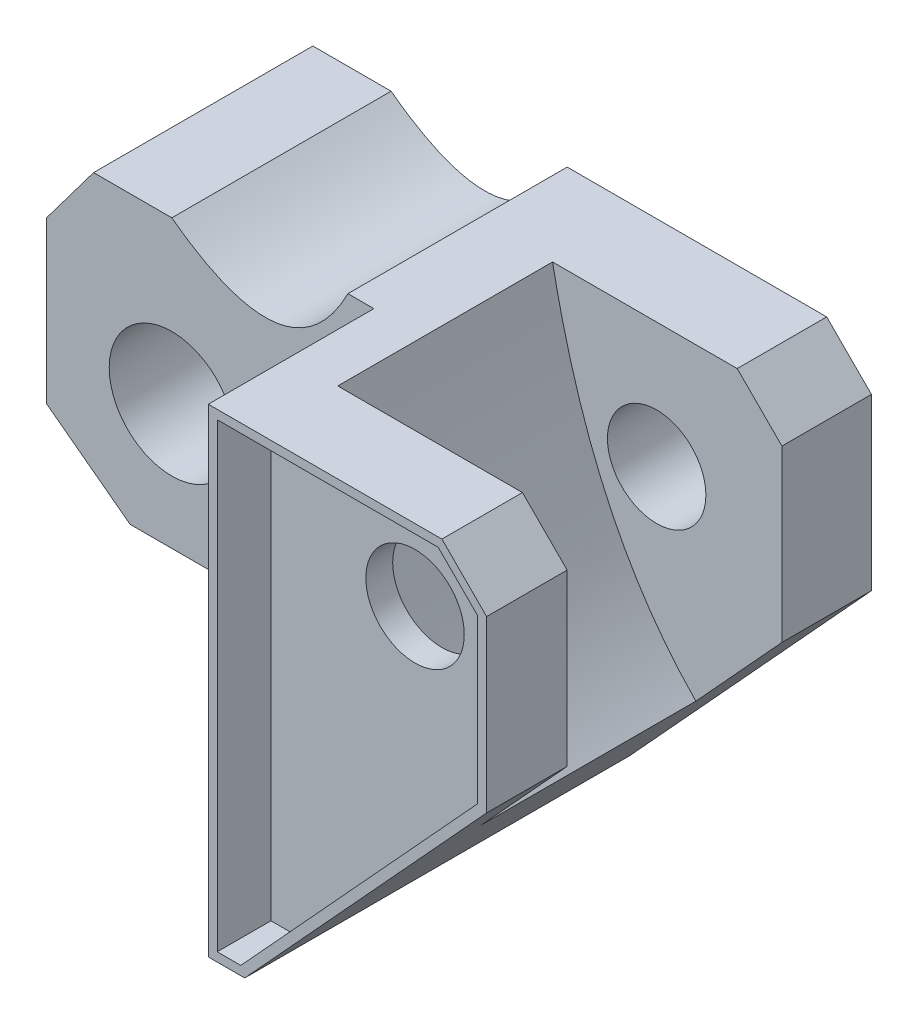
ISO-10303-21;
HEADER;
FILE_DESCRIPTION(('STEP AP214'),'2;1');
FILE_NAME('part.step','',(''),(''),'','','');
FILE_SCHEMA(('AUTOMOTIVE_DESIGN { 1 0 10303 214 1 1 1 1 }'));
ENDSEC;
DATA;
#1=APPLICATION_CONTEXT('core data for automotive mechanical design processes');
#2=APPLICATION_PROTOCOL_DEFINITION('international standard','automotive_design',2000,#1);
#3=PRODUCT_CONTEXT('',#1,'mechanical');
#4=PRODUCT('Part','Part','',(#3));
#5=PRODUCT_RELATED_PRODUCT_CATEGORY('part','',(#4));
#6=PRODUCT_DEFINITION_FORMATION('','',#4);
#7=PRODUCT_DEFINITION_CONTEXT('part definition',#1,'design');
#8=PRODUCT_DEFINITION('design','',#6,#7);
#9=PRODUCT_DEFINITION_SHAPE('','',#8);
#10=(LENGTH_UNIT() NAMED_UNIT(*) SI_UNIT(.MILLI.,.METRE.));
#11=(NAMED_UNIT(*) PLANE_ANGLE_UNIT() SI_UNIT($,.RADIAN.));
#12=(NAMED_UNIT(*) SI_UNIT($,.STERADIAN.) SOLID_ANGLE_UNIT());
#13=UNCERTAINTY_MEASURE_WITH_UNIT(LENGTH_MEASURE(1.E-05),#10,'distance_accuracy_value','');
#14=(GEOMETRIC_REPRESENTATION_CONTEXT(3) GLOBAL_UNCERTAINTY_ASSIGNED_CONTEXT((#13)) GLOBAL_UNIT_ASSIGNED_CONTEXT((#10,
#11,#12)) REPRESENTATION_CONTEXT('',''));
#15=CARTESIAN_POINT('',(0.,0.,0.));
#16=DIRECTION('',(0.,0.,1.));
#17=DIRECTION('',(1.,0.,0.));
#18=AXIS2_PLACEMENT_3D('',#15,#16,#17);
#19=CARTESIAN_POINT('',(44.3434185049688,20.4949550799156,0.));
#20=DIRECTION('',(0.,0.,1.));
#21=DIRECTION('',(1.,0.,0.));
#22=AXIS2_PLACEMENT_3D('',#19,#20,#21);
#23=CYLINDRICAL_SURFACE('',#22,5.5);
#24=CARTESIAN_POINT('',(44.3434185049688,20.4949550799156,34.));
#25=DIRECTION('',(0.,0.,-1.));
#26=DIRECTION('',(-1.,0.,0.));
#27=AXIS2_PLACEMENT_3D('',#24,#25,#26);
#28=CIRCLE('',#27,5.5);
#29=CARTESIAN_POINT('',(38.8434185049688,20.4949550799156,34.));
#30=VERTEX_POINT('',#29);
#31=EDGE_CURVE('E462',#30,#30,#28,.F.);
#32=ORIENTED_EDGE('',*,*,#31,.F.);
#33=EDGE_LOOP('',(#32));
#34=FACE_BOUND('',#33,.T.);
#35=CARTESIAN_POINT('',(44.3434185049688,20.4949550799156,37.));
#36=DIRECTION('',(0.,0.,1.));
#37=DIRECTION('',(1.,0.,0.));
#38=AXIS2_PLACEMENT_3D('',#35,#36,#37);
#39=CIRCLE('',#38,5.5);
#40=CARTESIAN_POINT('',(49.8434185049688,20.4949550799156,37.));
#41=VERTEX_POINT('',#40);
#42=EDGE_CURVE('E38',#41,#41,#39,.F.);
#43=ORIENTED_EDGE('',*,*,#42,.F.);
#44=EDGE_LOOP('',(#43));
#45=FACE_BOUND('',#44,.T.);
#46=ADVANCED_FACE('F34',(#34,#45),#23,.F.);
#47=CARTESIAN_POINT('',(16.2384776044973,27.6530155203271,43.));
#48=DIRECTION('',(0.,0.,-1.));
#49=DIRECTION('',(-1.,0.,0.));
#50=AXIS2_PLACEMENT_3D('',#47,#48,#49);
#51=PLANE('',#50);
#52=DIRECTION('',(-1.,0.,0.));
#53=VECTOR('',#52,1.);
#54=CARTESIAN_POINT('',(24.3434185049688,34.4949550799156,43.));
#55=LINE('',#54,#53);
#56=CARTESIAN_POINT('',(53.3434185049688,34.4949550799156,43.));
#57=VERTEX_POINT('',#56);
#58=CARTESIAN_POINT('',(27.2404140631224,34.4949550799156,43.));
#59=VERTEX_POINT('',#58);
#60=EDGE_CURVE('E374',#57,#59,#55,.T.);
#61=ORIENTED_EDGE('',*,*,#60,.T.);
#62=DIRECTION('',(0.,-1.,0.));
#63=VECTOR('',#62,1.);
#64=CARTESIAN_POINT('',(27.2404140631224,27.6530155203271,43.));
#65=LINE('',#64,#63);
#66=CARTESIAN_POINT('',(27.2404140631224,-19.,43.));
#67=VERTEX_POINT('',#66);
#68=EDGE_CURVE('E452',#59,#67,#65,.T.);
#69=ORIENTED_EDGE('',*,*,#68,.T.);
#70=DIRECTION('',(1.,0.,0.));
#71=VECTOR('',#70,1.);
#72=CARTESIAN_POINT('',(22.7993042127434,-19.,43.));
#73=LINE('',#72,#71);
#74=CARTESIAN_POINT('',(31.3098074254772,-19.,43.));
#75=VERTEX_POINT('',#74);
#76=EDGE_CURVE('E420',#67,#75,#73,.T.);
#77=ORIENTED_EDGE('',*,*,#76,.T.);
#78=DIRECTION('',(0.675678027498394,0.737196855090877,0.));
#79=VECTOR('',#78,1.);
#80=CARTESIAN_POINT('',(31.3098074254772,-19.,43.));
#81=LINE('',#80,#79);
#82=CARTESIAN_POINT('',(58.3434185049688,10.4949550799156,43.));
#83=VERTEX_POINT('',#82);
#84=EDGE_CURVE('E533',#75,#83,#81,.T.);
#85=ORIENTED_EDGE('',*,*,#84,.T.);
#86=DIRECTION('',(0.,1.,0.));
#87=VECTOR('',#86,1.);
#88=CARTESIAN_POINT('',(58.3434185049688,29.4949550799156,43.));
#89=LINE('',#88,#87);
#90=CARTESIAN_POINT('',(58.3434185049688,29.4949550799156,43.));
#91=VERTEX_POINT('',#90);
#92=EDGE_CURVE('E535',#83,#91,#89,.T.);
#93=ORIENTED_EDGE('',*,*,#92,.T.);
#94=DIRECTION('',(-0.707106781186546,0.707106781186549,0.));
#95=VECTOR('',#94,1.);
#96=CARTESIAN_POINT('',(53.3434185049688,34.4949550799156,43.));
#97=LINE('',#96,#95);
#98=EDGE_CURVE('E536',#91,#57,#97,.T.);
#99=ORIENTED_EDGE('',*,*,#98,.T.);
#100=EDGE_LOOP('',(#61,#69,#77,#85,#93,#99));
#101=FACE_BOUND('',#100,.T.);
#102=DIRECTION('',(0.,-1.,0.));
#103=VECTOR('',#102,1.);
#104=CARTESIAN_POINT('',(28.2404140631224,33.4949550799156,43.));
#105=LINE('',#104,#103);
#106=CARTESIAN_POINT('',(28.2404140631224,33.4949550799156,43.));
#107=VERTEX_POINT('',#106);
#108=CARTESIAN_POINT('',(28.2404140631224,-18.,43.));
#109=VERTEX_POINT('',#108);
#110=EDGE_CURVE('E50',#107,#109,#105,.T.);
#111=ORIENTED_EDGE('',*,*,#110,.F.);
#112=DIRECTION('',(-1.,0.,0.));
#113=VECTOR('',#112,1.);
#114=CARTESIAN_POINT('',(52.9292049425957,33.4949550799156,43.));
#115=LINE('',#114,#113);
#116=CARTESIAN_POINT('',(52.9292049425957,33.4949550799156,43.));
#117=VERTEX_POINT('',#116);
#118=EDGE_CURVE('E266',#117,#107,#115,.T.);
#119=ORIENTED_EDGE('',*,*,#118,.F.);
#120=DIRECTION('',(-0.707106781186546,0.707106781186549,0.));
#121=VECTOR('',#120,1.);
#122=CARTESIAN_POINT('',(57.3434185049688,29.0807415175425,43.));
#123=LINE('',#122,#121);
#124=CARTESIAN_POINT('',(57.3434185049688,29.0807415175425,43.));
#125=VERTEX_POINT('',#124);
#126=EDGE_CURVE('E252',#125,#117,#123,.T.);
#127=ORIENTED_EDGE('',*,*,#126,.F.);
#128=DIRECTION('',(0.,1.,0.));
#129=VECTOR('',#128,1.);
#130=CARTESIAN_POINT('',(57.3434185049688,10.8839023805731,43.));
#131=LINE('',#130,#129);
#132=CARTESIAN_POINT('',(57.3434185049688,10.8839023805731,43.));
#133=VERTEX_POINT('',#132);
#134=EDGE_CURVE('E225',#133,#125,#131,.T.);
#135=ORIENTED_EDGE('',*,*,#134,.F.);
#136=DIRECTION('',(0.675678027498394,0.737196855090877,0.));
#137=VECTOR('',#136,1.);
#138=CARTESIAN_POINT('',(30.869867984252,-18.,43.));
#139=LINE('',#138,#137);
#140=CARTESIAN_POINT('',(30.869867984252,-18.,43.));
#141=VERTEX_POINT('',#140);
#142=EDGE_CURVE('E209',#141,#133,#139,.T.);
#143=ORIENTED_EDGE('',*,*,#142,.F.);
#144=DIRECTION('',(1.,0.,0.));
#145=VECTOR('',#144,1.);
#146=CARTESIAN_POINT('',(28.2404140631224,-18.,43.));
#147=LINE('',#146,#145);
#148=EDGE_CURVE('E216',#109,#141,#147,.T.);
#149=ORIENTED_EDGE('',*,*,#148,.F.);
#150=EDGE_LOOP('',(#111,#119,#127,#135,#143,#149));
#151=FACE_BOUND('',#150,.T.);
#152=ADVANCED_FACE('F222',(#101,#151),#51,.F.);
#153=CARTESIAN_POINT('',(32.707782921424,43.,34.));
#154=DIRECTION('',(0.,0.,-1.));
#155=DIRECTION('',(-1.,0.,0.));
#156=AXIS2_PLACEMENT_3D('',#153,#154,#155);
#157=PLANE('',#156);
#158=ORIENTED_EDGE('',*,*,#31,.T.);
#159=EDGE_LOOP('',(#158));
#160=FACE_BOUND('',#159,.T.);
#161=DIRECTION('',(-0.675678027498394,-0.737196855090877,0.));
#162=VECTOR('',#161,1.);
#163=CARTESIAN_POINT('',(31.3098074254772,-19.,34.));
#164=LINE('',#163,#162);
#165=CARTESIAN_POINT('',(58.3434185049688,10.4949550799156,34.));
#166=VERTEX_POINT('',#165);
#167=CARTESIAN_POINT('',(48.7242638678977,0.,34.));
#168=VERTEX_POINT('',#167);
#169=EDGE_CURVE('E490',#166,#168,#164,.T.);
#170=ORIENTED_EDGE('',*,*,#169,.T.);
#171=CARTESIAN_POINT('',(48.7242638678977,0.,34.));
#172=CARTESIAN_POINT('',(39.5336475922639,9.34583082828209,34.));
#173=CARTESIAN_POINT('',(35.1693369893013,21.9791961089437,34.));
#174=CARTESIAN_POINT('',(32.707782921424,34.4949550799156,34.));
#175=B_SPLINE_CURVE_WITH_KNOTS('',3,(#171,#172,#173,#174),.UNSPECIFIED.,.F.,.F.,(4,4),(0.,1.),.UNSPECIFIED.);
#176=CARTESIAN_POINT('',(32.707782921424,34.4949550799156,34.));
#177=VERTEX_POINT('',#176);
#178=EDGE_CURVE('E286',#177,#168,#175,.F.);
#179=ORIENTED_EDGE('',*,*,#178,.F.);
#180=DIRECTION('',(1.,0.,0.));
#181=VECTOR('',#180,1.);
#182=CARTESIAN_POINT('',(24.3434185049688,34.4949550799156,34.));
#183=LINE('',#182,#181);
#184=CARTESIAN_POINT('',(53.3434185049688,34.4949550799156,34.));
#185=VERTEX_POINT('',#184);
#186=EDGE_CURVE('E465',#177,#185,#183,.T.);
#187=ORIENTED_EDGE('',*,*,#186,.T.);
#188=DIRECTION('',(0.707106781186546,-0.707106781186549,0.));
#189=VECTOR('',#188,1.);
#190=CARTESIAN_POINT('',(53.3434185049688,34.4949550799156,34.));
#191=LINE('',#190,#189);
#192=CARTESIAN_POINT('',(58.3434185049688,29.4949550799156,34.));
#193=VERTEX_POINT('',#192);
#194=EDGE_CURVE('E486',#185,#193,#191,.T.);
#195=ORIENTED_EDGE('',*,*,#194,.T.);
#196=DIRECTION('',(0.,-1.,0.));
#197=VECTOR('',#196,1.);
#198=CARTESIAN_POINT('',(58.3434185049688,29.4949550799156,34.));
#199=LINE('',#198,#197);
#200=EDGE_CURVE('E488',#193,#166,#199,.T.);
#201=ORIENTED_EDGE('',*,*,#200,.T.);
#202=EDGE_LOOP('',(#170,#179,#187,#195,#201));
#203=FACE_BOUND('',#202,.T.);
#204=ADVANCED_FACE('F319',(#160,#203),#157,.T.);
#205=CARTESIAN_POINT('',(32.707782921424,43.,10.));
#206=DIRECTION('',(0.,0.,-1.));
#207=DIRECTION('',(-1.,0.,0.));
#208=AXIS2_PLACEMENT_3D('',#205,#206,#207);
#209=PLANE('',#208);
#210=CARTESIAN_POINT('',(44.3434185049688,20.4949550799156,10.));
#211=DIRECTION('',(0.,0.,-1.));
#212=DIRECTION('',(-1.,0.,0.));
#213=AXIS2_PLACEMENT_3D('',#210,#211,#212);
#214=CIRCLE('',#213,5.5);
#215=CARTESIAN_POINT('',(38.8434185049688,20.4949550799156,10.));
#216=VERTEX_POINT('',#215);
#217=EDGE_CURVE('E291',#216,#216,#214,.F.);
#218=ORIENTED_EDGE('',*,*,#217,.F.);
#219=EDGE_LOOP('',(#218));
#220=FACE_BOUND('',#219,.T.);
#221=CARTESIAN_POINT('',(48.7242638678977,0.,10.));
#222=CARTESIAN_POINT('',(39.5336475922639,9.34583082828209,10.));
#223=CARTESIAN_POINT('',(35.1693369893013,21.9791961089437,10.));
#224=CARTESIAN_POINT('',(32.707782921424,34.4949550799156,10.));
#225=B_SPLINE_CURVE_WITH_KNOTS('',3,(#221,#222,#223,#224),.UNSPECIFIED.,.F.,.F.,(4,4),(0.,1.),.UNSPECIFIED.);
#226=CARTESIAN_POINT('',(48.7242638678977,0.,10.));
#227=VERTEX_POINT('',#226);
#228=CARTESIAN_POINT('',(32.707782921424,34.4949550799156,10.));
#229=VERTEX_POINT('',#228);
#230=EDGE_CURVE('E292',#227,#229,#225,.T.);
#231=ORIENTED_EDGE('',*,*,#230,.F.);
#232=DIRECTION('',(-0.675678027498394,-0.737196855090877,0.));
#233=VECTOR('',#232,1.);
#234=CARTESIAN_POINT('',(31.3098074254772,-19.,10.));
#235=LINE('',#234,#233);
#236=CARTESIAN_POINT('',(58.3434185049688,10.4949550799156,10.));
#237=VERTEX_POINT('',#236);
#238=EDGE_CURVE('E466',#237,#227,#235,.T.);
#239=ORIENTED_EDGE('',*,*,#238,.F.);
#240=DIRECTION('',(0.,-1.,0.));
#241=VECTOR('',#240,1.);
#242=CARTESIAN_POINT('',(58.3434185049688,29.4949550799156,10.));
#243=LINE('',#242,#241);
#244=CARTESIAN_POINT('',(58.3434185049688,29.4949550799156,10.));
#245=VERTEX_POINT('',#244);
#246=EDGE_CURVE('E479',#245,#237,#243,.T.);
#247=ORIENTED_EDGE('',*,*,#246,.F.);
#248=DIRECTION('',(0.707106781186546,-0.707106781186549,0.));
#249=VECTOR('',#248,1.);
#250=CARTESIAN_POINT('',(53.3434185049688,34.4949550799156,10.));
#251=LINE('',#250,#249);
#252=CARTESIAN_POINT('',(53.3434185049688,34.4949550799156,10.));
#253=VERTEX_POINT('',#252);
#254=EDGE_CURVE('E478',#253,#245,#251,.T.);
#255=ORIENTED_EDGE('',*,*,#254,.F.);
#256=DIRECTION('',(1.,0.,0.));
#257=VECTOR('',#256,1.);
#258=CARTESIAN_POINT('',(24.3434185049688,34.4949550799156,10.));
#259=LINE('',#258,#257);
#260=EDGE_CURVE('E461',#229,#253,#259,.T.);
#261=ORIENTED_EDGE('',*,*,#260,.F.);
#262=EDGE_LOOP('',(#231,#239,#247,#255,#261));
#263=FACE_BOUND('',#262,.T.);
#264=ADVANCED_FACE('F315',(#220,#263),#209,.F.);
#265=CARTESIAN_POINT('',(31.3098074254772,-19.,43.));
#266=DIRECTION('',(-0.737196855090877,0.675678027498394,0.));
#267=DIRECTION('',(-0.675678027498394,-0.737196855090877,0.));
#268=AXIS2_PLACEMENT_3D('',#265,#266,#267);
#269=PLANE('',#268);
#270=ORIENTED_EDGE('',*,*,#169,.F.);
#271=DIRECTION('',(0.,0.,-1.));
#272=VECTOR('',#271,1.);
#273=CARTESIAN_POINT('',(58.3434185049688,10.4949550799156,43.));
#274=LINE('',#273,#272);
#275=EDGE_CURVE('E442',#83,#166,#274,.T.);
#276=ORIENTED_EDGE('',*,*,#275,.F.);
#277=ORIENTED_EDGE('',*,*,#84,.F.);
#278=DIRECTION('',(0.,0.,-1.));
#279=VECTOR('',#278,1.);
#280=CARTESIAN_POINT('',(31.3098074254772,-19.,43.));
#281=LINE('',#280,#279);
#282=CARTESIAN_POINT('',(31.3098074254772,-19.,0.));
#283=VERTEX_POINT('',#282);
#284=EDGE_CURVE('E445',#75,#283,#281,.T.);
#285=ORIENTED_EDGE('',*,*,#284,.T.);
#286=DIRECTION('',(0.675678027498394,0.737196855090877,0.));
#287=VECTOR('',#286,1.);
#288=CARTESIAN_POINT('',(31.3098074254772,-19.,0.));
#289=LINE('',#288,#287);
#290=CARTESIAN_POINT('',(58.3434185049688,10.4949550799156,0.));
#291=VERTEX_POINT('',#290);
#292=EDGE_CURVE('E388',#283,#291,#289,.T.);
#293=ORIENTED_EDGE('',*,*,#292,.T.);
#294=EDGE_CURVE('E441',#237,#291,#274,.T.);
#295=ORIENTED_EDGE('',*,*,#294,.F.);
#296=ORIENTED_EDGE('',*,*,#238,.T.);
#297=DIRECTION('',(0.,0.,1.));
#298=VECTOR('',#297,1.);
#299=CARTESIAN_POINT('',(48.7242638678977,0.,43.));
#300=LINE('',#299,#298);
#301=EDGE_CURVE('E12',#227,#168,#300,.T.);
#302=ORIENTED_EDGE('',*,*,#301,.T.);
#303=EDGE_LOOP('',(#270,#276,#277,#285,#293,#295,#296,#302));
#304=FACE_BOUND('',#303,.T.);
#305=ADVANCED_FACE('F318',(#304),#269,.F.);
#306=CARTESIAN_POINT('',(58.3434185049688,29.4949550799156,43.));
#307=DIRECTION('',(-1.,0.,0.));
#308=DIRECTION('',(0.,0.,1.));
#309=AXIS2_PLACEMENT_3D('',#306,#307,#308);
#310=PLANE('',#309);
#311=ORIENTED_EDGE('',*,*,#200,.F.);
#312=DIRECTION('',(0.,0.,-1.));
#313=VECTOR('',#312,1.);
#314=CARTESIAN_POINT('',(58.3434185049688,29.4949550799156,43.));
#315=LINE('',#314,#313);
#316=EDGE_CURVE('E438',#91,#193,#315,.T.);
#317=ORIENTED_EDGE('',*,*,#316,.F.);
#318=ORIENTED_EDGE('',*,*,#92,.F.);
#319=ORIENTED_EDGE('',*,*,#275,.T.);
#320=EDGE_LOOP('',(#311,#317,#318,#319));
#321=FACE_BOUND('',#320,.T.);
#322=ADVANCED_FACE('F559',(#321),#310,.F.);
#323=CARTESIAN_POINT('',(53.3434185049688,34.4949550799156,43.));
#324=DIRECTION('',(-0.707106781186549,-0.707106781186546,0.));
#325=DIRECTION('',(0.707106781186546,-0.707106781186549,0.));
#326=AXIS2_PLACEMENT_3D('',#323,#324,#325);
#327=PLANE('',#326);
#328=ORIENTED_EDGE('',*,*,#194,.F.);
#329=DIRECTION('',(0.,0.,-1.));
#330=VECTOR('',#329,1.);
#331=CARTESIAN_POINT('',(53.3434185049688,34.4949550799156,43.));
#332=LINE('',#331,#330);
#333=EDGE_CURVE('E434',#57,#185,#332,.T.);
#334=ORIENTED_EDGE('',*,*,#333,.F.);
#335=ORIENTED_EDGE('',*,*,#98,.F.);
#336=ORIENTED_EDGE('',*,*,#316,.T.);
#337=EDGE_LOOP('',(#328,#334,#335,#336));
#338=FACE_BOUND('',#337,.T.);
#339=ADVANCED_FACE('F562',(#338),#327,.F.);
#340=CARTESIAN_POINT('',(24.3434185049688,34.4949550799156,43.));
#341=DIRECTION('',(0.,-1.,0.));
#342=DIRECTION('',(0.,0.,-1.));
#343=AXIS2_PLACEMENT_3D('',#340,#341,#342);
#344=PLANE('',#343);
#345=ORIENTED_EDGE('',*,*,#186,.F.);
#346=DIRECTION('',(0.,0.,1.));
#347=VECTOR('',#346,1.);
#348=CARTESIAN_POINT('',(32.707782921424,34.4949550799156,43.));
#349=LINE('',#348,#347);
#350=EDGE_CURVE('E43',#229,#177,#349,.T.);
#351=ORIENTED_EDGE('',*,*,#350,.F.);
#352=ORIENTED_EDGE('',*,*,#260,.T.);
#353=CARTESIAN_POINT('',(53.3434185049688,34.4949550799156,0.));
#354=VERTEX_POINT('',#353);
#355=EDGE_CURVE('E433',#253,#354,#332,.T.);
#356=ORIENTED_EDGE('',*,*,#355,.T.);
#357=DIRECTION('',(-1.,0.,0.));
#358=VECTOR('',#357,1.);
#359=CARTESIAN_POINT('',(24.3434185049688,34.4949550799156,0.));
#360=LINE('',#359,#358);
#361=CARTESIAN_POINT('',(24.3434185049688,34.4949550799156,0.));
#362=VERTEX_POINT('',#361);
#363=EDGE_CURVE('E397',#354,#362,#360,.T.);
#364=ORIENTED_EDGE('',*,*,#363,.T.);
#365=DIRECTION('',(0.,0.,-1.));
#366=VECTOR('',#365,1.);
#367=CARTESIAN_POINT('',(24.3434185049688,34.4949550799156,43.));
#368=LINE('',#367,#366);
#369=CARTESIAN_POINT('',(24.3434185049688,34.4949550799156,24.502948031465));
#370=VERTEX_POINT('',#369);
#371=EDGE_CURVE('E431',#370,#362,#368,.T.);
#372=ORIENTED_EDGE('',*,*,#371,.F.);
#373=DIRECTION('',(-1.,0.,0.));
#374=VECTOR('',#373,1.);
#375=CARTESIAN_POINT('',(27.2404140631224,34.4949550799156,24.502948031465));
#376=LINE('',#375,#374);
#377=CARTESIAN_POINT('',(27.2404140631224,34.4949550799156,24.502948031465));
#378=VERTEX_POINT('',#377);
#379=EDGE_CURVE('E494',#378,#370,#376,.T.);
#380=ORIENTED_EDGE('',*,*,#379,.F.);
#381=DIRECTION('',(0.,0.,-1.));
#382=VECTOR('',#381,1.);
#383=CARTESIAN_POINT('',(27.2404140631224,34.4949550799156,43.502948031465));
#384=LINE('',#383,#382);
#385=EDGE_CURVE('E492',#59,#378,#384,.T.);
#386=ORIENTED_EDGE('',*,*,#385,.F.);
#387=ORIENTED_EDGE('',*,*,#60,.F.);
#388=ORIENTED_EDGE('',*,*,#333,.T.);
#389=EDGE_LOOP('',(#345,#351,#352,#356,#364,#372,#380,#386,#387,#388));
#390=FACE_BOUND('',#389,.T.);
#391=ADVANCED_FACE('F367',(#390),#344,.F.);
#392=CARTESIAN_POINT('',(0.,0.,43.));
#393=DIRECTION('',(0.,1.,0.));
#394=DIRECTION('',(0.,0.,1.));
#395=AXIS2_PLACEMENT_3D('',#392,#393,#394);
#396=PLANE('',#395);
#397=DIRECTION('',(0.,0.,-1.));
#398=VECTOR('',#397,1.);
#399=CARTESIAN_POINT('',(18.7065659103684,0.,43.));
#400=LINE('',#399,#398);
#401=CARTESIAN_POINT('',(18.7065659103684,0.,24.502948031465));
#402=VERTEX_POINT('',#401);
#403=CARTESIAN_POINT('',(18.7065659103684,0.,0.));
#404=VERTEX_POINT('',#403);
#405=EDGE_CURVE('E450',#402,#404,#400,.T.);
#406=ORIENTED_EDGE('',*,*,#405,.F.);
#407=DIRECTION('',(-1.,0.,0.));
#408=VECTOR('',#407,1.);
#409=CARTESIAN_POINT('',(0.,0.,24.502948031465));
#410=LINE('',#409,#408);
#411=CARTESIAN_POINT('',(0.,0.,24.502948031465));
#412=VERTEX_POINT('',#411);
#413=EDGE_CURVE('E518',#402,#412,#410,.T.);
#414=ORIENTED_EDGE('',*,*,#413,.T.);
#415=DIRECTION('',(0.,0.,-1.));
#416=VECTOR('',#415,1.);
#417=CARTESIAN_POINT('',(0.,0.,43.));
#418=LINE('',#417,#416);
#419=CARTESIAN_POINT('',(0.,0.,0.));
#420=VERTEX_POINT('',#419);
#421=EDGE_CURVE('E421',#412,#420,#418,.T.);
#422=ORIENTED_EDGE('',*,*,#421,.T.);
#423=DIRECTION('',(1.,0.,0.));
#424=VECTOR('',#423,1.);
#425=CARTESIAN_POINT('',(0.,0.,0.));
#426=LINE('',#425,#424);
#427=EDGE_CURVE('E376',#420,#404,#426,.T.);
#428=ORIENTED_EDGE('',*,*,#427,.T.);
#429=EDGE_LOOP('',(#406,#414,#422,#428));
#430=FACE_BOUND('',#429,.T.);
#431=ADVANCED_FACE('F36',(#430),#396,.F.);
#432=CARTESIAN_POINT('',(18.7065659103684,0.,43.));
#433=DIRECTION('',(0.977577220548624,0.210577249161507,0.));
#434=DIRECTION('',(-0.210577249161507,0.977577220548624,0.));
#435=AXIS2_PLACEMENT_3D('',#432,#433,#434);
#436=PLANE('',#435);
#437=DIRECTION('',(0.,0.,-1.));
#438=VECTOR('',#437,1.);
#439=CARTESIAN_POINT('',(22.7993042127434,-19.,43.));
#440=LINE('',#439,#438);
#441=CARTESIAN_POINT('',(22.7993042127434,-19.,24.502948031465));
#442=VERTEX_POINT('',#441);
#443=CARTESIAN_POINT('',(22.7993042127434,-19.,0.));
#444=VERTEX_POINT('',#443);
#445=EDGE_CURVE('E448',#442,#444,#440,.T.);
#446=ORIENTED_EDGE('',*,*,#445,.F.);
#447=DIRECTION('',(-0.210577249161507,0.977577220548624,0.));
#448=VECTOR('',#447,1.);
#449=CARTESIAN_POINT('',(18.7065659103684,0.,24.502948031465));
#450=LINE('',#449,#448);
#451=EDGE_CURVE('E524',#442,#402,#450,.T.);
#452=ORIENTED_EDGE('',*,*,#451,.T.);
#453=ORIENTED_EDGE('',*,*,#405,.T.);
#454=DIRECTION('',(0.210577249161507,-0.977577220548624,0.));
#455=VECTOR('',#454,1.);
#456=CARTESIAN_POINT('',(18.7065659103684,0.,0.));
#457=LINE('',#456,#455);
#458=EDGE_CURVE('E382',#404,#444,#457,.T.);
#459=ORIENTED_EDGE('',*,*,#458,.T.);
#460=EDGE_LOOP('',(#446,#452,#453,#459));
#461=FACE_BOUND('',#460,.T.);
#462=ADVANCED_FACE('F588',(#461),#436,.F.);
#463=CARTESIAN_POINT('',(22.7993042127434,-19.,43.));
#464=DIRECTION('',(0.,1.,0.));
#465=DIRECTION('',(0.,0.,1.));
#466=AXIS2_PLACEMENT_3D('',#463,#464,#465);
#467=PLANE('',#466);
#468=ORIENTED_EDGE('',*,*,#76,.F.);
#469=DIRECTION('',(0.,0.,-1.));
#470=VECTOR('',#469,1.);
#471=CARTESIAN_POINT('',(27.2404140631224,-19.,43.502948031465));
#472=LINE('',#471,#470);
#473=CARTESIAN_POINT('',(27.2404140631224,-19.,24.502948031465));
#474=VERTEX_POINT('',#473);
#475=EDGE_CURVE('E58',#67,#474,#472,.T.);
#476=ORIENTED_EDGE('',*,*,#475,.T.);
#477=DIRECTION('',(-1.,0.,0.));
#478=VECTOR('',#477,1.);
#479=CARTESIAN_POINT('',(27.2404140631224,-19.,24.502948031465));
#480=LINE('',#479,#478);
#481=EDGE_CURVE('E497',#474,#442,#480,.T.);
#482=ORIENTED_EDGE('',*,*,#481,.T.);
#483=ORIENTED_EDGE('',*,*,#445,.T.);
#484=DIRECTION('',(1.,0.,0.));
#485=VECTOR('',#484,1.);
#486=CARTESIAN_POINT('',(22.7993042127434,-19.,0.));
#487=LINE('',#486,#485);
#488=EDGE_CURVE('E386',#444,#283,#487,.T.);
#489=ORIENTED_EDGE('',*,*,#488,.T.);
#490=ORIENTED_EDGE('',*,*,#284,.F.);
#491=EDGE_LOOP('',(#468,#476,#482,#483,#489,#490));
#492=FACE_BOUND('',#491,.T.);
#493=ADVANCED_FACE('F549',(#492),#467,.F.);
#494=CARTESIAN_POINT('',(58.3434185049688,29.4949550799156,0.));
#495=VERTEX_POINT('',#494);
#496=EDGE_CURVE('E437',#245,#495,#315,.T.);
#497=ORIENTED_EDGE('',*,*,#496,.F.);
#498=ORIENTED_EDGE('',*,*,#246,.T.);
#499=ORIENTED_EDGE('',*,*,#294,.T.);
#500=DIRECTION('',(0.,1.,0.));
#501=VECTOR('',#500,1.);
#502=CARTESIAN_POINT('',(58.3434185049688,29.4949550799156,0.));
#503=LINE('',#502,#501);
#504=EDGE_CURVE('E391',#291,#495,#503,.T.);
#505=ORIENTED_EDGE('',*,*,#504,.T.);
#506=EDGE_LOOP('',(#497,#498,#499,#505));
#507=FACE_BOUND('',#506,.T.);
#508=ADVANCED_FACE('F567',(#507),#310,.F.);
#509=ORIENTED_EDGE('',*,*,#355,.F.);
#510=ORIENTED_EDGE('',*,*,#254,.T.);
#511=ORIENTED_EDGE('',*,*,#496,.T.);
#512=DIRECTION('',(-0.707106781186546,0.707106781186549,0.));
#513=VECTOR('',#512,1.);
#514=CARTESIAN_POINT('',(53.3434185049688,34.4949550799156,0.));
#515=LINE('',#514,#513);
#516=EDGE_CURVE('E394',#495,#354,#515,.T.);
#517=ORIENTED_EDGE('',*,*,#516,.T.);
#518=EDGE_LOOP('',(#509,#510,#511,#517));
#519=FACE_BOUND('',#518,.T.);
#520=ADVANCED_FACE('F365',(#519),#327,.F.);
#521=CARTESIAN_POINT('',(24.3434185049688,34.4949550799156,43.));
#522=CARTESIAN_POINT('',(17.9704489870093,22.0585535006964,43.));
#523=CARTESIAN_POINT('',(4.6695939390017,32.,43.));
#524=B_SPLINE_CURVE_WITH_KNOTS('',2,(#521,#522,#523),.UNSPECIFIED.,.F.,.F.,(3,3),(0.,1.),.UNSPECIFIED.);
#525=DIRECTION('',(0.,0.,-1.));
#526=VECTOR('',#525,1.);
#527=SURFACE_OF_LINEAR_EXTRUSION('',#524,#526);
#528=DIRECTION('',(0.,0.,-1.));
#529=VECTOR('',#528,1.);
#530=CARTESIAN_POINT('',(4.66959393900169,32.,43.));
#531=LINE('',#530,#529);
#532=CARTESIAN_POINT('',(4.66959393900168,32.,24.502948031465));
#533=VERTEX_POINT('',#532);
#534=CARTESIAN_POINT('',(4.66959393900169,32.,0.));
#535=VERTEX_POINT('',#534);
#536=EDGE_CURVE('E429',#533,#535,#531,.T.);
#537=ORIENTED_EDGE('',*,*,#536,.F.);
#538=CARTESIAN_POINT('',(24.3434185049688,34.4949550799156,24.502948031465));
#539=CARTESIAN_POINT('',(17.9704489870093,22.0585535006964,24.502948031465));
#540=CARTESIAN_POINT('',(4.6695939390017,32.,24.502948031465));
#541=B_SPLINE_CURVE_WITH_KNOTS('',2,(#538,#539,#540),.UNSPECIFIED.,.F.,.F.,(3,3),(0.,1.),.UNSPECIFIED.);
#542=EDGE_CURVE('E513',#533,#370,#541,.F.);
#543=ORIENTED_EDGE('',*,*,#542,.T.);
#544=ORIENTED_EDGE('',*,*,#371,.T.);
#545=CARTESIAN_POINT('',(24.3434185049688,34.4949550799156,0.));
#546=CARTESIAN_POINT('',(17.9704489870093,22.0585535006964,0.));
#547=CARTESIAN_POINT('',(4.6695939390017,32.,0.));
#548=B_SPLINE_CURVE_WITH_KNOTS('',2,(#545,#546,#547),.UNSPECIFIED.,.F.,.F.,(3,3),(0.,1.),.UNSPECIFIED.);
#549=EDGE_CURVE('E400',#362,#535,#548,.T.);
#550=ORIENTED_EDGE('',*,*,#549,.T.);
#551=EDGE_LOOP('',(#537,#543,#544,#550));
#552=FACE_BOUND('',#551,.T.);
#553=ADVANCED_FACE('F360',(#552),#527,.F.);
#554=CARTESIAN_POINT('',(-4.0787589537172,32.,43.));
#555=DIRECTION('',(0.,-1.,0.));
#556=DIRECTION('',(0.,0.,-1.));
#557=AXIS2_PLACEMENT_3D('',#554,#555,#556);
#558=PLANE('',#557);
#559=DIRECTION('',(0.,0.,-1.));
#560=VECTOR('',#559,1.);
#561=CARTESIAN_POINT('',(-4.0787589537172,32.,43.));
#562=LINE('',#561,#560);
#563=CARTESIAN_POINT('',(-4.0787589537172,32.,24.502948031465));
#564=VERTEX_POINT('',#563);
#565=CARTESIAN_POINT('',(-4.0787589537172,32.,0.));
#566=VERTEX_POINT('',#565);
#567=EDGE_CURVE('E427',#564,#566,#562,.T.);
#568=ORIENTED_EDGE('',*,*,#567,.F.);
#569=DIRECTION('',(1.,0.,0.));
#570=VECTOR('',#569,1.);
#571=CARTESIAN_POINT('',(-4.0787589537172,32.,24.502948031465));
#572=LINE('',#571,#570);
#573=EDGE_CURVE('E510',#564,#533,#572,.T.);
#574=ORIENTED_EDGE('',*,*,#573,.T.);
#575=ORIENTED_EDGE('',*,*,#536,.T.);
#576=DIRECTION('',(-1.,0.,0.));
#577=VECTOR('',#576,1.);
#578=CARTESIAN_POINT('',(-4.0787589537172,32.,0.));
#579=LINE('',#578,#577);
#580=EDGE_CURVE('E405',#535,#566,#579,.T.);
#581=ORIENTED_EDGE('',*,*,#580,.T.);
#582=EDGE_LOOP('',(#568,#574,#575,#581));
#583=FACE_BOUND('',#582,.T.);
#584=ADVANCED_FACE('F356',(#583),#558,.F.);
#585=CARTESIAN_POINT('',(-9.33040606099831,25.,43.));
#586=DIRECTION('',(0.799909645536407,-0.600120453723934,0.));
#587=DIRECTION('',(0.600120453723934,0.799909645536407,0.));
#588=AXIS2_PLACEMENT_3D('',#585,#586,#587);
#589=PLANE('',#588);
#590=DIRECTION('',(0.,0.,-1.));
#591=VECTOR('',#590,1.);
#592=CARTESIAN_POINT('',(-9.33040606099831,25.,43.));
#593=LINE('',#592,#591);
#594=CARTESIAN_POINT('',(-9.33040606099831,25.,24.502948031465));
#595=VERTEX_POINT('',#594);
#596=CARTESIAN_POINT('',(-9.33040606099831,25.,0.));
#597=VERTEX_POINT('',#596);
#598=EDGE_CURVE('E425',#595,#597,#593,.T.);
#599=ORIENTED_EDGE('',*,*,#598,.F.);
#600=DIRECTION('',(0.600120453723934,0.799909645536407,0.));
#601=VECTOR('',#600,1.);
#602=CARTESIAN_POINT('',(-9.33040606099832,25.,24.502948031465));
#603=LINE('',#602,#601);
#604=EDGE_CURVE('E507',#595,#564,#603,.T.);
#605=ORIENTED_EDGE('',*,*,#604,.T.);
#606=ORIENTED_EDGE('',*,*,#567,.T.);
#607=DIRECTION('',(-0.600120453723934,-0.799909645536407,0.));
#608=VECTOR('',#607,1.);
#609=CARTESIAN_POINT('',(-9.33040606099831,25.,0.));
#610=LINE('',#609,#608);
#611=EDGE_CURVE('E411',#566,#597,#610,.T.);
#612=ORIENTED_EDGE('',*,*,#611,.T.);
#613=EDGE_LOOP('',(#599,#605,#606,#612));
#614=FACE_BOUND('',#613,.T.);
#615=ADVANCED_FACE('F352',(#614),#589,.F.);
#616=CARTESIAN_POINT('',(-9.33040606099831,7.,43.));
#617=DIRECTION('',(1.,0.,0.));
#618=DIRECTION('',(0.,0.,-1.));
#619=AXIS2_PLACEMENT_3D('',#616,#617,#618);
#620=PLANE('',#619);
#621=DIRECTION('',(0.,0.,-1.));
#622=VECTOR('',#621,1.);
#623=CARTESIAN_POINT('',(-9.33040606099831,7.,43.));
#624=LINE('',#623,#622);
#625=CARTESIAN_POINT('',(-9.33040606099831,7.,24.502948031465));
#626=VERTEX_POINT('',#625);
#627=CARTESIAN_POINT('',(-9.33040606099831,7.,0.));
#628=VERTEX_POINT('',#627);
#629=EDGE_CURVE('E423',#626,#628,#624,.T.);
#630=ORIENTED_EDGE('',*,*,#629,.F.);
#631=DIRECTION('',(0.,1.,0.));
#632=VECTOR('',#631,1.);
#633=CARTESIAN_POINT('',(-9.33040606099831,7.,24.502948031465));
#634=LINE('',#633,#632);
#635=EDGE_CURVE('E504',#626,#595,#634,.T.);
#636=ORIENTED_EDGE('',*,*,#635,.T.);
#637=ORIENTED_EDGE('',*,*,#598,.T.);
#638=DIRECTION('',(0.,-1.,0.));
#639=VECTOR('',#638,1.);
#640=CARTESIAN_POINT('',(-9.33040606099831,7.,0.));
#641=LINE('',#640,#639);
#642=EDGE_CURVE('E414',#597,#628,#641,.T.);
#643=ORIENTED_EDGE('',*,*,#642,.T.);
#644=EDGE_LOOP('',(#630,#636,#637,#643));
#645=FACE_BOUND('',#644,.T.);
#646=ADVANCED_FACE('F348',(#645),#620,.F.);
#647=CARTESIAN_POINT('',(0.,0.,43.));
#648=DIRECTION('',(0.600120453723934,0.799909645536407,0.));
#649=DIRECTION('',(-0.799909645536407,0.600120453723934,0.));
#650=AXIS2_PLACEMENT_3D('',#647,#648,#649);
#651=PLANE('',#650);
#652=ORIENTED_EDGE('',*,*,#421,.F.);
#653=DIRECTION('',(-0.799909645536407,0.600120453723934,0.));
#654=VECTOR('',#653,1.);
#655=CARTESIAN_POINT('',(0.,0.,24.502948031465));
#656=LINE('',#655,#654);
#657=EDGE_CURVE('E456',#412,#626,#656,.T.);
#658=ORIENTED_EDGE('',*,*,#657,.T.);
#659=ORIENTED_EDGE('',*,*,#629,.T.);
#660=DIRECTION('',(0.799909645536407,-0.600120453723934,0.));
#661=VECTOR('',#660,1.);
#662=CARTESIAN_POINT('',(0.,0.,0.));
#663=LINE('',#662,#661);
#664=EDGE_CURVE('E417',#628,#420,#663,.T.);
#665=ORIENTED_EDGE('',*,*,#664,.T.);
#666=EDGE_LOOP('',(#652,#658,#659,#665));
#667=FACE_BOUND('',#666,.T.);
#668=ADVANCED_FACE('F344',(#667),#651,.F.);
#669=CARTESIAN_POINT('',(16.2384776044973,27.6530155203271,0.));
#670=DIRECTION('',(0.,0.,-1.));
#671=DIRECTION('',(-1.,0.,0.));
#672=AXIS2_PLACEMENT_3D('',#669,#670,#671);
#673=PLANE('',#672);
#674=CARTESIAN_POINT('',(44.3434185049688,20.4949550799156,0.));
#675=DIRECTION('',(0.,0.,1.));
#676=DIRECTION('',(1.,0.,0.));
#677=AXIS2_PLACEMENT_3D('',#674,#675,#676);
#678=CIRCLE('',#677,5.5);
#679=CARTESIAN_POINT('',(49.8434185049688,20.4949550799156,0.));
#680=VERTEX_POINT('',#679);
#681=EDGE_CURVE('E527',#680,#680,#678,.T.);
#682=ORIENTED_EDGE('',*,*,#681,.T.);
#683=EDGE_LOOP('',(#682));
#684=FACE_BOUND('',#683,.T.);
#685=CARTESIAN_POINT('',(4.66959393900169,14.,0.));
#686=DIRECTION('',(0.,0.,-1.));
#687=DIRECTION('',(-1.,0.,0.));
#688=AXIS2_PLACEMENT_3D('',#685,#686,#687);
#689=CIRCLE('',#688,7.);
#690=CARTESIAN_POINT('',(-2.33040606099831,14.,0.));
#691=VERTEX_POINT('',#690);
#692=EDGE_CURVE('E383',#691,#691,#689,.T.);
#693=ORIENTED_EDGE('',*,*,#692,.F.);
#694=EDGE_LOOP('',(#693));
#695=FACE_BOUND('',#694,.T.);
#696=ORIENTED_EDGE('',*,*,#427,.F.);
#697=ORIENTED_EDGE('',*,*,#664,.F.);
#698=ORIENTED_EDGE('',*,*,#642,.F.);
#699=ORIENTED_EDGE('',*,*,#611,.F.);
#700=ORIENTED_EDGE('',*,*,#580,.F.);
#701=ORIENTED_EDGE('',*,*,#549,.F.);
#702=ORIENTED_EDGE('',*,*,#363,.F.);
#703=ORIENTED_EDGE('',*,*,#516,.F.);
#704=ORIENTED_EDGE('',*,*,#504,.F.);
#705=ORIENTED_EDGE('',*,*,#292,.F.);
#706=ORIENTED_EDGE('',*,*,#488,.F.);
#707=ORIENTED_EDGE('',*,*,#458,.F.);
#708=EDGE_LOOP('',(#696,#697,#698,#699,#700,#701,#702,#703,#704,#705,#706,#707));
#709=FACE_BOUND('',#708,.T.);
#710=ADVANCED_FACE('F337',(#684,#695,#709),#673,.T.);
#711=CARTESIAN_POINT('',(4.66959393900169,14.,43.));
#712=DIRECTION('',(0.,0.,-1.));
#713=DIRECTION('',(-1.,0.,0.));
#714=AXIS2_PLACEMENT_3D('',#711,#712,#713);
#715=CYLINDRICAL_SURFACE('',#714,7.);
#716=CARTESIAN_POINT('',(4.66959393900169,14.,24.502948031465));
#717=DIRECTION('',(0.,0.,-1.));
#718=DIRECTION('',(-1.,0.,0.));
#719=AXIS2_PLACEMENT_3D('',#716,#717,#718);
#720=CIRCLE('',#719,7.);
#721=CARTESIAN_POINT('',(-2.33040606099831,14.,24.502948031465));
#722=VERTEX_POINT('',#721);
#723=EDGE_CURVE('E453',#722,#722,#720,.F.);
#724=ORIENTED_EDGE('',*,*,#723,.T.);
#725=EDGE_LOOP('',(#724));
#726=FACE_BOUND('',#725,.T.);
#727=ORIENTED_EDGE('',*,*,#692,.T.);
#728=EDGE_LOOP('',(#727));
#729=FACE_BOUND('',#728,.T.);
#730=ADVANCED_FACE('F333',(#726,#729),#715,.F.);
#731=ORIENTED_EDGE('',*,*,#217,.T.);
#732=EDGE_LOOP('',(#731));
#733=FACE_BOUND('',#732,.T.);
#734=ORIENTED_EDGE('',*,*,#681,.F.);
#735=EDGE_LOOP('',(#734));
#736=FACE_BOUND('',#735,.T.);
#737=ADVANCED_FACE('F330',(#733,#736),#23,.F.);
#738=CARTESIAN_POINT('',(27.2404140631224,-19.,43.502948031465));
#739=DIRECTION('',(1.,0.,0.));
#740=DIRECTION('',(0.,0.,-1.));
#741=AXIS2_PLACEMENT_3D('',#738,#739,#740);
#742=PLANE('',#741);
#743=ORIENTED_EDGE('',*,*,#385,.T.);
#744=DIRECTION('',(0.,1.,0.));
#745=VECTOR('',#744,1.);
#746=CARTESIAN_POINT('',(27.2404140631224,-19.,24.502948031465));
#747=LINE('',#746,#745);
#748=EDGE_CURVE('E457',#474,#378,#747,.T.);
#749=ORIENTED_EDGE('',*,*,#748,.F.);
#750=ORIENTED_EDGE('',*,*,#475,.F.);
#751=ORIENTED_EDGE('',*,*,#68,.F.);
#752=EDGE_LOOP('',(#743,#749,#750,#751));
#753=FACE_BOUND('',#752,.T.);
#754=ADVANCED_FACE('F326',(#753),#742,.F.);
#755=CARTESIAN_POINT('',(27.2404140631224,-19.,24.502948031465));
#756=DIRECTION('',(0.,0.,-1.));
#757=DIRECTION('',(-1.,0.,0.));
#758=AXIS2_PLACEMENT_3D('',#755,#756,#757);
#759=PLANE('',#758);
#760=ORIENTED_EDGE('',*,*,#723,.F.);
#761=EDGE_LOOP('',(#760));
#762=FACE_BOUND('',#761,.T.);
#763=ORIENTED_EDGE('',*,*,#481,.F.);
#764=ORIENTED_EDGE('',*,*,#748,.T.);
#765=ORIENTED_EDGE('',*,*,#379,.T.);
#766=ORIENTED_EDGE('',*,*,#542,.F.);
#767=ORIENTED_EDGE('',*,*,#573,.F.);
#768=ORIENTED_EDGE('',*,*,#604,.F.);
#769=ORIENTED_EDGE('',*,*,#635,.F.);
#770=ORIENTED_EDGE('',*,*,#657,.F.);
#771=ORIENTED_EDGE('',*,*,#413,.F.);
#772=ORIENTED_EDGE('',*,*,#451,.F.);
#773=EDGE_LOOP('',(#763,#764,#765,#766,#767,#768,#769,#770,#771,#772));
#774=FACE_BOUND('',#773,.T.);
#775=ADVANCED_FACE('F312',(#762,#774),#759,.F.);
#776=CARTESIAN_POINT('',(48.7242638678977,0.,72.0319548258323));
#777=CARTESIAN_POINT('',(39.5336475922639,9.34583082828209,72.0319548258323));
#778=CARTESIAN_POINT('',(35.1693369893013,21.9791961089437,72.0319548258323));
#779=CARTESIAN_POINT('',(32.707782921424,34.4949550799156,72.0319548258323));
#780=B_SPLINE_CURVE_WITH_KNOTS('',3,(#776,#777,#778,#779),.UNSPECIFIED.,.F.,.F.,(4,4),(0.,1.),.UNSPECIFIED.);
#781=DIRECTION('',(0.,0.,-1.));
#782=VECTOR('',#781,1.);
#783=SURFACE_OF_LINEAR_EXTRUSION('',#780,#782);
#784=ORIENTED_EDGE('',*,*,#350,.T.);
#785=ORIENTED_EDGE('',*,*,#178,.T.);
#786=ORIENTED_EDGE('',*,*,#301,.F.);
#787=ORIENTED_EDGE('',*,*,#230,.T.);
#788=EDGE_LOOP('',(#784,#785,#786,#787));
#789=FACE_BOUND('',#788,.T.);
#790=ADVANCED_FACE('F307',(#789),#783,.F.);
#791=CARTESIAN_POINT('',(0.,0.,37.));
#792=DIRECTION('',(0.,0.,1.));
#793=DIRECTION('',(1.,0.,0.));
#794=AXIS2_PLACEMENT_3D('',#791,#792,#793);
#795=PLANE('',#794);
#796=DIRECTION('',(0.,-1.,0.));
#797=VECTOR('',#796,1.);
#798=CARTESIAN_POINT('',(28.2404140631224,33.4949550799156,37.));
#799=LINE('',#798,#797);
#800=CARTESIAN_POINT('',(28.2404140631224,33.4949550799156,37.));
#801=VERTEX_POINT('',#800);
#802=CARTESIAN_POINT('',(28.2404140631224,-18.,37.));
#803=VERTEX_POINT('',#802);
#804=EDGE_CURVE('E233',#801,#803,#799,.T.);
#805=ORIENTED_EDGE('',*,*,#804,.T.);
#806=DIRECTION('',(1.,0.,0.));
#807=VECTOR('',#806,1.);
#808=CARTESIAN_POINT('',(28.2404140631224,-18.,37.));
#809=LINE('',#808,#807);
#810=CARTESIAN_POINT('',(30.869867984252,-18.,37.));
#811=VERTEX_POINT('',#810);
#812=EDGE_CURVE('E220',#803,#811,#809,.T.);
#813=ORIENTED_EDGE('',*,*,#812,.T.);
#814=DIRECTION('',(0.675678027498394,0.737196855090877,0.));
#815=VECTOR('',#814,1.);
#816=CARTESIAN_POINT('',(30.869867984252,-18.,37.));
#817=LINE('',#816,#815);
#818=CARTESIAN_POINT('',(57.3434185049688,10.8839023805731,37.));
#819=VERTEX_POINT('',#818);
#820=EDGE_CURVE('E211',#811,#819,#817,.T.);
#821=ORIENTED_EDGE('',*,*,#820,.T.);
#822=DIRECTION('',(0.,1.,0.));
#823=VECTOR('',#822,1.);
#824=CARTESIAN_POINT('',(57.3434185049688,10.8839023805731,37.));
#825=LINE('',#824,#823);
#826=CARTESIAN_POINT('',(57.3434185049688,29.0807415175425,37.));
#827=VERTEX_POINT('',#826);
#828=EDGE_CURVE('E245',#819,#827,#825,.T.);
#829=ORIENTED_EDGE('',*,*,#828,.T.);
#830=DIRECTION('',(-0.707106781186546,0.707106781186549,0.));
#831=VECTOR('',#830,1.);
#832=CARTESIAN_POINT('',(57.3434185049688,29.0807415175425,37.));
#833=LINE('',#832,#831);
#834=CARTESIAN_POINT('',(52.9292049425957,33.4949550799156,37.));
#835=VERTEX_POINT('',#834);
#836=EDGE_CURVE('E258',#827,#835,#833,.T.);
#837=ORIENTED_EDGE('',*,*,#836,.T.);
#838=DIRECTION('',(-1.,0.,0.));
#839=VECTOR('',#838,1.);
#840=CARTESIAN_POINT('',(52.9292049425957,33.4949550799156,37.));
#841=LINE('',#840,#839);
#842=EDGE_CURVE('E272',#835,#801,#841,.T.);
#843=ORIENTED_EDGE('',*,*,#842,.T.);
#844=EDGE_LOOP('',(#805,#813,#821,#829,#837,#843));
#845=FACE_BOUND('',#844,.T.);
#846=ORIENTED_EDGE('',*,*,#42,.T.);
#847=EDGE_LOOP('',(#846));
#848=FACE_BOUND('',#847,.T.);
#849=ADVANCED_FACE('F311',(#845,#848),#795,.T.);
#850=CARTESIAN_POINT('',(28.2404140631224,33.4949550799156,43.));
#851=DIRECTION('',(1.,0.,0.));
#852=DIRECTION('',(0.,0.,-1.));
#853=AXIS2_PLACEMENT_3D('',#850,#851,#852);
#854=PLANE('',#853);
#855=ORIENTED_EDGE('',*,*,#804,.F.);
#856=DIRECTION('',(0.,0.,-1.));
#857=VECTOR('',#856,1.);
#858=CARTESIAN_POINT('',(28.2404140631224,33.4949550799156,43.));
#859=LINE('',#858,#857);
#860=EDGE_CURVE('E235',#107,#801,#859,.T.);
#861=ORIENTED_EDGE('',*,*,#860,.F.);
#862=ORIENTED_EDGE('',*,*,#110,.T.);
#863=DIRECTION('',(0.,0.,-1.));
#864=VECTOR('',#863,1.);
#865=CARTESIAN_POINT('',(28.2404140631224,-18.,43.));
#866=LINE('',#865,#864);
#867=EDGE_CURVE('E218',#109,#803,#866,.T.);
#868=ORIENTED_EDGE('',*,*,#867,.T.);
#869=EDGE_LOOP('',(#855,#861,#862,#868));
#870=FACE_BOUND('',#869,.T.);
#871=ADVANCED_FACE('F608',(#870),#854,.T.);
#872=CARTESIAN_POINT('',(52.9292049425957,33.4949550799156,43.));
#873=DIRECTION('',(0.,-1.,0.));
#874=DIRECTION('',(0.,0.,-1.));
#875=AXIS2_PLACEMENT_3D('',#872,#873,#874);
#876=PLANE('',#875);
#877=ORIENTED_EDGE('',*,*,#842,.F.);
#878=DIRECTION('',(0.,0.,-1.));
#879=VECTOR('',#878,1.);
#880=CARTESIAN_POINT('',(52.9292049425957,33.4949550799156,43.));
#881=LINE('',#880,#879);
#882=EDGE_CURVE('E269',#117,#835,#881,.T.);
#883=ORIENTED_EDGE('',*,*,#882,.F.);
#884=ORIENTED_EDGE('',*,*,#118,.T.);
#885=ORIENTED_EDGE('',*,*,#860,.T.);
#886=EDGE_LOOP('',(#877,#883,#884,#885));
#887=FACE_BOUND('',#886,.T.);
#888=ADVANCED_FACE('F613',(#887),#876,.T.);
#889=CARTESIAN_POINT('',(57.3434185049688,29.0807415175425,43.));
#890=DIRECTION('',(-0.707106781186549,-0.707106781186546,0.));
#891=DIRECTION('',(0.707106781186546,-0.707106781186549,0.));
#892=AXIS2_PLACEMENT_3D('',#889,#890,#891);
#893=PLANE('',#892);
#894=ORIENTED_EDGE('',*,*,#836,.F.);
#895=DIRECTION('',(0.,0.,-1.));
#896=VECTOR('',#895,1.);
#897=CARTESIAN_POINT('',(57.3434185049688,29.0807415175425,43.));
#898=LINE('',#897,#896);
#899=EDGE_CURVE('E255',#125,#827,#898,.T.);
#900=ORIENTED_EDGE('',*,*,#899,.F.);
#901=ORIENTED_EDGE('',*,*,#126,.T.);
#902=ORIENTED_EDGE('',*,*,#882,.T.);
#903=EDGE_LOOP('',(#894,#900,#901,#902));
#904=FACE_BOUND('',#903,.T.);
#905=ADVANCED_FACE('F624',(#904),#893,.T.);
#906=CARTESIAN_POINT('',(57.3434185049688,10.8839023805731,43.));
#907=DIRECTION('',(-1.,0.,0.));
#908=DIRECTION('',(0.,0.,1.));
#909=AXIS2_PLACEMENT_3D('',#906,#907,#908);
#910=PLANE('',#909);
#911=ORIENTED_EDGE('',*,*,#828,.F.);
#912=DIRECTION('',(0.,0.,-1.));
#913=VECTOR('',#912,1.);
#914=CARTESIAN_POINT('',(57.3434185049688,10.8839023805731,43.));
#915=LINE('',#914,#913);
#916=EDGE_CURVE('E243',#133,#819,#915,.T.);
#917=ORIENTED_EDGE('',*,*,#916,.F.);
#918=ORIENTED_EDGE('',*,*,#134,.T.);
#919=ORIENTED_EDGE('',*,*,#899,.T.);
#920=EDGE_LOOP('',(#911,#917,#918,#919));
#921=FACE_BOUND('',#920,.T.);
#922=ADVANCED_FACE('F619',(#921),#910,.T.);
#923=CARTESIAN_POINT('',(30.869867984252,-18.,43.));
#924=DIRECTION('',(-0.737196855090877,0.675678027498394,0.));
#925=DIRECTION('',(-0.675678027498394,-0.737196855090877,0.));
#926=AXIS2_PLACEMENT_3D('',#923,#924,#925);
#927=PLANE('',#926);
#928=ORIENTED_EDGE('',*,*,#820,.F.);
#929=DIRECTION('',(0.,0.,-1.));
#930=VECTOR('',#929,1.);
#931=CARTESIAN_POINT('',(30.869867984252,-18.,43.));
#932=LINE('',#931,#930);
#933=EDGE_CURVE('E204',#141,#811,#932,.T.);
#934=ORIENTED_EDGE('',*,*,#933,.F.);
#935=ORIENTED_EDGE('',*,*,#142,.T.);
#936=ORIENTED_EDGE('',*,*,#916,.T.);
#937=EDGE_LOOP('',(#928,#934,#935,#936));
#938=FACE_BOUND('',#937,.T.);
#939=ADVANCED_FACE('F206',(#938),#927,.T.);
#940=CARTESIAN_POINT('',(28.2404140631224,-18.,43.));
#941=DIRECTION('',(0.,1.,0.));
#942=DIRECTION('',(0.,0.,1.));
#943=AXIS2_PLACEMENT_3D('',#940,#941,#942);
#944=PLANE('',#943);
#945=ORIENTED_EDGE('',*,*,#812,.F.);
#946=ORIENTED_EDGE('',*,*,#867,.F.);
#947=ORIENTED_EDGE('',*,*,#148,.T.);
#948=ORIENTED_EDGE('',*,*,#933,.T.);
#949=EDGE_LOOP('',(#945,#946,#947,#948));
#950=FACE_BOUND('',#949,.T.);
#951=ADVANCED_FACE('F217',(#950),#944,.T.);
#952=CLOSED_SHELL('',(#46,#152,#204,#264,#305,#322,#339,#391,#431,#462,#493,#508,#520,#553,#584,
#615,#646,#668,#710,#730,#737,#754,#775,#790,#849,#871,#888,#905,#922,#939,#951));
#953=MANIFOLD_SOLID_BREP('B2',#952);
#954=ADVANCED_BREP_SHAPE_REPRESENTATION('',(#18,#953),#14);
#955=SHAPE_DEFINITION_REPRESENTATION(#9,#954);
ENDSEC;
END-ISO-10303-21;
